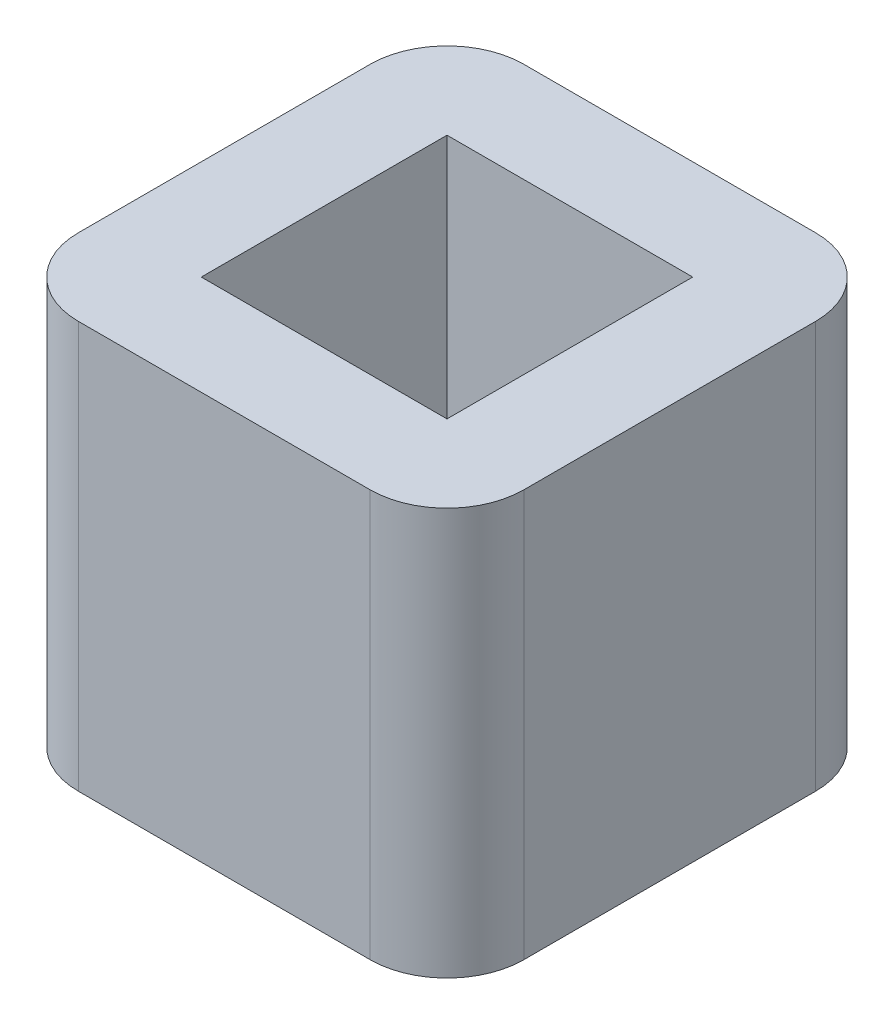
ISO-10303-21;
HEADER;
FILE_DESCRIPTION(('STEP AP214'),'2;1');
FILE_NAME('part.step','',(''),(''),'','','');
FILE_SCHEMA(('AUTOMOTIVE_DESIGN { 1 0 10303 214 1 1 1 1 }'));
ENDSEC;
DATA;
#1=APPLICATION_CONTEXT('core data for automotive mechanical design processes');
#2=APPLICATION_PROTOCOL_DEFINITION('international standard','automotive_design',2000,#1);
#3=PRODUCT_CONTEXT('',#1,'mechanical');
#4=PRODUCT('Part','Part','',(#3));
#5=PRODUCT_RELATED_PRODUCT_CATEGORY('part','',(#4));
#6=PRODUCT_DEFINITION_FORMATION('','',#4);
#7=PRODUCT_DEFINITION_CONTEXT('part definition',#1,'design');
#8=PRODUCT_DEFINITION('design','',#6,#7);
#9=PRODUCT_DEFINITION_SHAPE('','',#8);
#10=(LENGTH_UNIT() NAMED_UNIT(*) SI_UNIT(.MILLI.,.METRE.));
#11=(NAMED_UNIT(*) PLANE_ANGLE_UNIT() SI_UNIT($,.RADIAN.));
#12=(NAMED_UNIT(*) SI_UNIT($,.STERADIAN.) SOLID_ANGLE_UNIT());
#13=UNCERTAINTY_MEASURE_WITH_UNIT(LENGTH_MEASURE(1.E-05),#10,'distance_accuracy_value','');
#14=(GEOMETRIC_REPRESENTATION_CONTEXT(3) GLOBAL_UNCERTAINTY_ASSIGNED_CONTEXT((#13)) GLOBAL_UNIT_ASSIGNED_CONTEXT((#10,
#11,#12)) REPRESENTATION_CONTEXT('',''));
#15=CARTESIAN_POINT('',(0.,0.,0.));
#16=DIRECTION('',(0.,0.,1.));
#17=DIRECTION('',(1.,0.,0.));
#18=AXIS2_PLACEMENT_3D('',#15,#16,#17);
#19=CARTESIAN_POINT('',(19.,26.5,-19.));
#20=DIRECTION('',(0.,1.,0.));
#21=DIRECTION('',(0.,0.,1.));
#22=AXIS2_PLACEMENT_3D('',#19,#20,#21);
#23=PLANE('',#22);
#24=CARTESIAN_POINT('',(19.,26.5,-19.));
#25=DIRECTION('',(0.,1.,0.));
#26=DIRECTION('',(0.,0.,1.));
#27=AXIS2_PLACEMENT_3D('',#24,#25,#26);
#28=CIRCLE('',#27,10.);
#29=CARTESIAN_POINT('',(29.,26.5,-18.9999999999999));
#30=VERTEX_POINT('',#29);
#31=CARTESIAN_POINT('',(18.9999999999999,26.5,-29.));
#32=VERTEX_POINT('',#31);
#33=EDGE_CURVE('E158',#30,#32,#28,.T.);
#34=ORIENTED_EDGE('',*,*,#33,.T.);
#35=DIRECTION('',(-1.,0.,0.));
#36=VECTOR('',#35,1.);
#37=CARTESIAN_POINT('',(-18.9999999999999,26.5,-29.));
#38=LINE('',#37,#36);
#39=CARTESIAN_POINT('',(-19.,26.5,-29.));
#40=VERTEX_POINT('',#39);
#41=EDGE_CURVE('E161',#32,#40,#38,.T.);
#42=ORIENTED_EDGE('',*,*,#41,.T.);
#43=CARTESIAN_POINT('',(-19.,26.5,-19.));
#44=DIRECTION('',(0.,1.,0.));
#45=DIRECTION('',(0.,0.,-1.));
#46=AXIS2_PLACEMENT_3D('',#43,#44,#45);
#47=CIRCLE('',#46,10.);
#48=CARTESIAN_POINT('',(-29.,26.5,-18.9999999999999));
#49=VERTEX_POINT('',#48);
#50=EDGE_CURVE('E164',#40,#49,#47,.T.);
#51=ORIENTED_EDGE('',*,*,#50,.T.);
#52=DIRECTION('',(0.,0.,1.));
#53=VECTOR('',#52,1.);
#54=CARTESIAN_POINT('',(-29.,26.5,-18.9999999999999));
#55=LINE('',#54,#53);
#56=CARTESIAN_POINT('',(-29.,26.5,18.9999999999999));
#57=VERTEX_POINT('',#56);
#58=EDGE_CURVE('E166',#49,#57,#55,.T.);
#59=ORIENTED_EDGE('',*,*,#58,.T.);
#60=CARTESIAN_POINT('',(-19.,26.5,19.));
#61=DIRECTION('',(0.,1.,0.));
#62=DIRECTION('',(0.,0.,-1.));
#63=AXIS2_PLACEMENT_3D('',#60,#61,#62);
#64=CIRCLE('',#63,10.);
#65=CARTESIAN_POINT('',(-18.9999999999999,26.5,29.));
#66=VERTEX_POINT('',#65);
#67=EDGE_CURVE('E168',#57,#66,#64,.T.);
#68=ORIENTED_EDGE('',*,*,#67,.T.);
#69=DIRECTION('',(1.,0.,0.));
#70=VECTOR('',#69,1.);
#71=CARTESIAN_POINT('',(-18.9999999999999,26.5,29.));
#72=LINE('',#71,#70);
#73=CARTESIAN_POINT('',(18.9999999999999,26.5,29.));
#74=VERTEX_POINT('',#73);
#75=EDGE_CURVE('E170',#66,#74,#72,.T.);
#76=ORIENTED_EDGE('',*,*,#75,.T.);
#77=CARTESIAN_POINT('',(19.,26.5,19.));
#78=DIRECTION('',(0.,1.,0.));
#79=DIRECTION('',(0.,0.,-1.));
#80=AXIS2_PLACEMENT_3D('',#77,#78,#79);
#81=CIRCLE('',#80,10.);
#82=CARTESIAN_POINT('',(29.,26.5,18.9999999999999));
#83=VERTEX_POINT('',#82);
#84=EDGE_CURVE('E172',#74,#83,#81,.T.);
#85=ORIENTED_EDGE('',*,*,#84,.T.);
#86=DIRECTION('',(0.,0.,-1.));
#87=VECTOR('',#86,1.);
#88=CARTESIAN_POINT('',(29.,26.5,-18.9999999999999));
#89=LINE('',#88,#87);
#90=EDGE_CURVE('E174',#83,#30,#89,.T.);
#91=ORIENTED_EDGE('',*,*,#90,.T.);
#92=EDGE_LOOP('',(#34,#42,#51,#59,#68,#76,#85,#91));
#93=FACE_BOUND('',#92,.T.);
#94=DIRECTION('',(-1.,0.,0.));
#95=VECTOR('',#94,1.);
#96=CARTESIAN_POINT('',(-16.,26.5,-16.));
#97=LINE('',#96,#95);
#98=CARTESIAN_POINT('',(16.,26.5,-16.));
#99=VERTEX_POINT('',#98);
#100=CARTESIAN_POINT('',(-16.,26.5,-16.));
#101=VERTEX_POINT('',#100);
#102=EDGE_CURVE('E130',#99,#101,#97,.T.);
#103=ORIENTED_EDGE('',*,*,#102,.F.);
#104=DIRECTION('',(0.,0.,-1.));
#105=VECTOR('',#104,1.);
#106=CARTESIAN_POINT('',(16.,26.5,-16.));
#107=LINE('',#106,#105);
#108=CARTESIAN_POINT('',(16.,26.5,16.));
#109=VERTEX_POINT('',#108);
#110=EDGE_CURVE('E122',#109,#99,#107,.T.);
#111=ORIENTED_EDGE('',*,*,#110,.F.);
#112=DIRECTION('',(1.,0.,0.));
#113=VECTOR('',#112,1.);
#114=CARTESIAN_POINT('',(-16.,26.5,16.));
#115=LINE('',#114,#113);
#116=CARTESIAN_POINT('',(-16.,26.5,16.));
#117=VERTEX_POINT('',#116);
#118=EDGE_CURVE('E144',#117,#109,#115,.T.);
#119=ORIENTED_EDGE('',*,*,#118,.F.);
#120=DIRECTION('',(0.,0.,1.));
#121=VECTOR('',#120,1.);
#122=CARTESIAN_POINT('',(-16.,26.5,-16.));
#123=LINE('',#122,#121);
#124=EDGE_CURVE('E142',#101,#117,#123,.T.);
#125=ORIENTED_EDGE('',*,*,#124,.F.);
#126=EDGE_LOOP('',(#103,#111,#119,#125));
#127=FACE_BOUND('',#126,.T.);
#128=ADVANCED_FACE('F33',(#93,#127),#23,.T.);
#129=CARTESIAN_POINT('',(19.,-26.5,-19.));
#130=DIRECTION('',(0.,1.,0.));
#131=DIRECTION('',(0.,0.,1.));
#132=AXIS2_PLACEMENT_3D('',#129,#130,#131);
#133=PLANE('',#132);
#134=CARTESIAN_POINT('',(19.,-26.5,-19.));
#135=DIRECTION('',(0.,1.,0.));
#136=DIRECTION('',(0.,0.,1.));
#137=AXIS2_PLACEMENT_3D('',#134,#135,#136);
#138=CIRCLE('',#137,10.);
#139=CARTESIAN_POINT('',(29.,-26.5,-18.9999999999999));
#140=VERTEX_POINT('',#139);
#141=CARTESIAN_POINT('',(18.9999999999999,-26.5,-29.));
#142=VERTEX_POINT('',#141);
#143=EDGE_CURVE('E138',#140,#142,#138,.T.);
#144=ORIENTED_EDGE('',*,*,#143,.F.);
#145=DIRECTION('',(0.,0.,-1.));
#146=VECTOR('',#145,1.);
#147=CARTESIAN_POINT('',(29.,-26.5,-18.9999999999999));
#148=LINE('',#147,#146);
#149=CARTESIAN_POINT('',(29.,-26.5,18.9999999999999));
#150=VERTEX_POINT('',#149);
#151=EDGE_CURVE('E162',#150,#140,#148,.T.);
#152=ORIENTED_EDGE('',*,*,#151,.F.);
#153=CARTESIAN_POINT('',(19.,-26.5,19.));
#154=DIRECTION('',(0.,1.,0.));
#155=DIRECTION('',(0.,0.,-1.));
#156=AXIS2_PLACEMENT_3D('',#153,#154,#155);
#157=CIRCLE('',#156,10.);
#158=CARTESIAN_POINT('',(18.9999999999999,-26.5,29.));
#159=VERTEX_POINT('',#158);
#160=EDGE_CURVE('E189',#159,#150,#157,.T.);
#161=ORIENTED_EDGE('',*,*,#160,.F.);
#162=DIRECTION('',(1.,0.,0.));
#163=VECTOR('',#162,1.);
#164=CARTESIAN_POINT('',(-18.9999999999999,-26.5,29.));
#165=LINE('',#164,#163);
#166=CARTESIAN_POINT('',(-18.9999999999999,-26.5,29.));
#167=VERTEX_POINT('',#166);
#168=EDGE_CURVE('E187',#167,#159,#165,.T.);
#169=ORIENTED_EDGE('',*,*,#168,.F.);
#170=CARTESIAN_POINT('',(-19.,-26.5,19.));
#171=DIRECTION('',(0.,1.,0.));
#172=DIRECTION('',(0.,0.,-1.));
#173=AXIS2_PLACEMENT_3D('',#170,#171,#172);
#174=CIRCLE('',#173,10.);
#175=CARTESIAN_POINT('',(-29.,-26.5,18.9999999999999));
#176=VERTEX_POINT('',#175);
#177=EDGE_CURVE('E185',#176,#167,#174,.T.);
#178=ORIENTED_EDGE('',*,*,#177,.F.);
#179=DIRECTION('',(0.,0.,1.));
#180=VECTOR('',#179,1.);
#181=CARTESIAN_POINT('',(-29.,-26.5,-18.9999999999999));
#182=LINE('',#181,#180);
#183=CARTESIAN_POINT('',(-29.,-26.5,-18.9999999999999));
#184=VERTEX_POINT('',#183);
#185=EDGE_CURVE('E183',#184,#176,#182,.T.);
#186=ORIENTED_EDGE('',*,*,#185,.F.);
#187=CARTESIAN_POINT('',(-19.,-26.5,-19.));
#188=DIRECTION('',(0.,1.,0.));
#189=DIRECTION('',(0.,0.,-1.));
#190=AXIS2_PLACEMENT_3D('',#187,#188,#189);
#191=CIRCLE('',#190,10.);
#192=CARTESIAN_POINT('',(-19.,-26.5,-29.));
#193=VERTEX_POINT('',#192);
#194=EDGE_CURVE('E181',#193,#184,#191,.T.);
#195=ORIENTED_EDGE('',*,*,#194,.F.);
#196=DIRECTION('',(-1.,0.,0.));
#197=VECTOR('',#196,1.);
#198=CARTESIAN_POINT('',(-18.9999999999999,-26.5,-29.));
#199=LINE('',#198,#197);
#200=EDGE_CURVE('E179',#142,#193,#199,.T.);
#201=ORIENTED_EDGE('',*,*,#200,.F.);
#202=EDGE_LOOP('',(#144,#152,#161,#169,#178,#186,#195,#201));
#203=FACE_BOUND('',#202,.T.);
#204=DIRECTION('',(0.,0.,-1.));
#205=VECTOR('',#204,1.);
#206=CARTESIAN_POINT('',(16.,-26.5,-16.));
#207=LINE('',#206,#205);
#208=CARTESIAN_POINT('',(16.,-26.5,16.));
#209=VERTEX_POINT('',#208);
#210=CARTESIAN_POINT('',(16.,-26.5,-16.));
#211=VERTEX_POINT('',#210);
#212=EDGE_CURVE('E56',#209,#211,#207,.T.);
#213=ORIENTED_EDGE('',*,*,#212,.T.);
#214=DIRECTION('',(-1.,0.,0.));
#215=VECTOR('',#214,1.);
#216=CARTESIAN_POINT('',(-16.,-26.5,-16.));
#217=LINE('',#216,#215);
#218=CARTESIAN_POINT('',(-16.,-26.5,-16.));
#219=VERTEX_POINT('',#218);
#220=EDGE_CURVE('E137',#211,#219,#217,.T.);
#221=ORIENTED_EDGE('',*,*,#220,.T.);
#222=DIRECTION('',(0.,0.,1.));
#223=VECTOR('',#222,1.);
#224=CARTESIAN_POINT('',(-16.,-26.5,-16.));
#225=LINE('',#224,#223);
#226=CARTESIAN_POINT('',(-16.,-26.5,16.));
#227=VERTEX_POINT('',#226);
#228=EDGE_CURVE('E150',#219,#227,#225,.T.);
#229=ORIENTED_EDGE('',*,*,#228,.T.);
#230=DIRECTION('',(1.,0.,0.));
#231=VECTOR('',#230,1.);
#232=CARTESIAN_POINT('',(-16.,-26.5,16.));
#233=LINE('',#232,#231);
#234=EDGE_CURVE('E131',#227,#209,#233,.T.);
#235=ORIENTED_EDGE('',*,*,#234,.T.);
#236=EDGE_LOOP('',(#213,#221,#229,#235));
#237=FACE_BOUND('',#236,.T.);
#238=ADVANCED_FACE('F219',(#203,#237),#133,.F.);
#239=CARTESIAN_POINT('',(19.,26.5,-19.));
#240=DIRECTION('',(0.,-1.,0.));
#241=DIRECTION('',(0.,0.,-1.));
#242=AXIS2_PLACEMENT_3D('',#239,#240,#241);
#243=CYLINDRICAL_SURFACE('',#242,10.);
#244=ORIENTED_EDGE('',*,*,#143,.T.);
#245=DIRECTION('',(0.,-1.,0.));
#246=VECTOR('',#245,1.);
#247=CARTESIAN_POINT('',(18.9999999999999,26.5,-29.));
#248=LINE('',#247,#246);
#249=EDGE_CURVE('E11',#32,#142,#248,.T.);
#250=ORIENTED_EDGE('',*,*,#249,.F.);
#251=ORIENTED_EDGE('',*,*,#33,.F.);
#252=DIRECTION('',(0.,-1.,0.));
#253=VECTOR('',#252,1.);
#254=CARTESIAN_POINT('',(29.,26.5,-18.9999999999999));
#255=LINE('',#254,#253);
#256=EDGE_CURVE('E176',#30,#140,#255,.T.);
#257=ORIENTED_EDGE('',*,*,#256,.T.);
#258=EDGE_LOOP('',(#244,#250,#251,#257));
#259=FACE_BOUND('',#258,.T.);
#260=ADVANCED_FACE('F35',(#259),#243,.T.);
#261=CARTESIAN_POINT('',(-18.9999999999999,26.5,-29.));
#262=DIRECTION('',(0.,0.,1.));
#263=DIRECTION('',(1.,0.,0.));
#264=AXIS2_PLACEMENT_3D('',#261,#262,#263);
#265=PLANE('',#264);
#266=ORIENTED_EDGE('',*,*,#200,.T.);
#267=DIRECTION('',(0.,-1.,0.));
#268=VECTOR('',#267,1.);
#269=CARTESIAN_POINT('',(-19.,26.5,-29.));
#270=LINE('',#269,#268);
#271=EDGE_CURVE('E41',#40,#193,#270,.T.);
#272=ORIENTED_EDGE('',*,*,#271,.F.);
#273=ORIENTED_EDGE('',*,*,#41,.F.);
#274=ORIENTED_EDGE('',*,*,#249,.T.);
#275=EDGE_LOOP('',(#266,#272,#273,#274));
#276=FACE_BOUND('',#275,.T.);
#277=ADVANCED_FACE('F236',(#276),#265,.F.);
#278=CARTESIAN_POINT('',(-19.,26.5,-19.));
#279=DIRECTION('',(0.,-1.,0.));
#280=DIRECTION('',(0.,0.,-1.));
#281=AXIS2_PLACEMENT_3D('',#278,#279,#280);
#282=CYLINDRICAL_SURFACE('',#281,10.);
#283=ORIENTED_EDGE('',*,*,#194,.T.);
#284=DIRECTION('',(0.,-1.,0.));
#285=VECTOR('',#284,1.);
#286=CARTESIAN_POINT('',(-29.,26.5,-18.9999999999999));
#287=LINE('',#286,#285);
#288=EDGE_CURVE('E206',#49,#184,#287,.T.);
#289=ORIENTED_EDGE('',*,*,#288,.F.);
#290=ORIENTED_EDGE('',*,*,#50,.F.);
#291=ORIENTED_EDGE('',*,*,#271,.T.);
#292=EDGE_LOOP('',(#283,#289,#290,#291));
#293=FACE_BOUND('',#292,.T.);
#294=ADVANCED_FACE('F213',(#293),#282,.T.);
#295=CARTESIAN_POINT('',(-29.,26.5,-18.9999999999999));
#296=DIRECTION('',(1.,0.,0.));
#297=DIRECTION('',(0.,0.,-1.));
#298=AXIS2_PLACEMENT_3D('',#295,#296,#297);
#299=PLANE('',#298);
#300=ORIENTED_EDGE('',*,*,#185,.T.);
#301=DIRECTION('',(0.,-1.,0.));
#302=VECTOR('',#301,1.);
#303=CARTESIAN_POINT('',(-29.,26.5,18.9999999999999));
#304=LINE('',#303,#302);
#305=EDGE_CURVE('E203',#57,#176,#304,.T.);
#306=ORIENTED_EDGE('',*,*,#305,.F.);
#307=ORIENTED_EDGE('',*,*,#58,.F.);
#308=ORIENTED_EDGE('',*,*,#288,.T.);
#309=EDGE_LOOP('',(#300,#306,#307,#308));
#310=FACE_BOUND('',#309,.T.);
#311=ADVANCED_FACE('F225',(#310),#299,.F.);
#312=CARTESIAN_POINT('',(-19.,26.5,19.));
#313=DIRECTION('',(0.,-1.,0.));
#314=DIRECTION('',(0.,0.,-1.));
#315=AXIS2_PLACEMENT_3D('',#312,#313,#314);
#316=CYLINDRICAL_SURFACE('',#315,10.);
#317=ORIENTED_EDGE('',*,*,#177,.T.);
#318=DIRECTION('',(0.,-1.,0.));
#319=VECTOR('',#318,1.);
#320=CARTESIAN_POINT('',(-18.9999999999999,26.5,29.));
#321=LINE('',#320,#319);
#322=EDGE_CURVE('E200',#66,#167,#321,.T.);
#323=ORIENTED_EDGE('',*,*,#322,.F.);
#324=ORIENTED_EDGE('',*,*,#67,.F.);
#325=ORIENTED_EDGE('',*,*,#305,.T.);
#326=EDGE_LOOP('',(#317,#323,#324,#325));
#327=FACE_BOUND('',#326,.T.);
#328=ADVANCED_FACE('F229',(#327),#316,.T.);
#329=CARTESIAN_POINT('',(-18.9999999999999,26.5,29.));
#330=DIRECTION('',(0.,0.,-1.));
#331=DIRECTION('',(-1.,0.,0.));
#332=AXIS2_PLACEMENT_3D('',#329,#330,#331);
#333=PLANE('',#332);
#334=ORIENTED_EDGE('',*,*,#168,.T.);
#335=DIRECTION('',(0.,-1.,0.));
#336=VECTOR('',#335,1.);
#337=CARTESIAN_POINT('',(18.9999999999999,26.5,29.));
#338=LINE('',#337,#336);
#339=EDGE_CURVE('E197',#74,#159,#338,.T.);
#340=ORIENTED_EDGE('',*,*,#339,.F.);
#341=ORIENTED_EDGE('',*,*,#75,.F.);
#342=ORIENTED_EDGE('',*,*,#322,.T.);
#343=EDGE_LOOP('',(#334,#340,#341,#342));
#344=FACE_BOUND('',#343,.T.);
#345=ADVANCED_FACE('F249',(#344),#333,.F.);
#346=CARTESIAN_POINT('',(19.,26.5,19.));
#347=DIRECTION('',(0.,-1.,0.));
#348=DIRECTION('',(0.,0.,-1.));
#349=AXIS2_PLACEMENT_3D('',#346,#347,#348);
#350=CYLINDRICAL_SURFACE('',#349,10.);
#351=ORIENTED_EDGE('',*,*,#160,.T.);
#352=DIRECTION('',(0.,-1.,0.));
#353=VECTOR('',#352,1.);
#354=CARTESIAN_POINT('',(29.,26.5,18.9999999999999));
#355=LINE('',#354,#353);
#356=EDGE_CURVE('E194',#83,#150,#355,.T.);
#357=ORIENTED_EDGE('',*,*,#356,.F.);
#358=ORIENTED_EDGE('',*,*,#84,.F.);
#359=ORIENTED_EDGE('',*,*,#339,.T.);
#360=EDGE_LOOP('',(#351,#357,#358,#359));
#361=FACE_BOUND('',#360,.T.);
#362=ADVANCED_FACE('F247',(#361),#350,.T.);
#363=CARTESIAN_POINT('',(29.,26.5,-18.9999999999999));
#364=DIRECTION('',(-1.,0.,0.));
#365=DIRECTION('',(0.,0.,1.));
#366=AXIS2_PLACEMENT_3D('',#363,#364,#365);
#367=PLANE('',#366);
#368=ORIENTED_EDGE('',*,*,#151,.T.);
#369=ORIENTED_EDGE('',*,*,#256,.F.);
#370=ORIENTED_EDGE('',*,*,#90,.F.);
#371=ORIENTED_EDGE('',*,*,#356,.T.);
#372=EDGE_LOOP('',(#368,#369,#370,#371));
#373=FACE_BOUND('',#372,.T.);
#374=ADVANCED_FACE('F242',(#373),#367,.F.);
#375=CARTESIAN_POINT('',(16.,26.5,-16.));
#376=DIRECTION('',(-1.,0.,0.));
#377=DIRECTION('',(0.,0.,1.));
#378=AXIS2_PLACEMENT_3D('',#375,#376,#377);
#379=PLANE('',#378);
#380=ORIENTED_EDGE('',*,*,#212,.F.);
#381=DIRECTION('',(0.,-1.,0.));
#382=VECTOR('',#381,1.);
#383=CARTESIAN_POINT('',(16.,26.5,16.));
#384=LINE('',#383,#382);
#385=EDGE_CURVE('E126',#109,#209,#384,.T.);
#386=ORIENTED_EDGE('',*,*,#385,.F.);
#387=ORIENTED_EDGE('',*,*,#110,.T.);
#388=DIRECTION('',(0.,-1.,0.));
#389=VECTOR('',#388,1.);
#390=CARTESIAN_POINT('',(16.,26.5,-16.));
#391=LINE('',#390,#389);
#392=EDGE_CURVE('E125',#99,#211,#391,.T.);
#393=ORIENTED_EDGE('',*,*,#392,.T.);
#394=EDGE_LOOP('',(#380,#386,#387,#393));
#395=FACE_BOUND('',#394,.T.);
#396=ADVANCED_FACE('F124',(#395),#379,.T.);
#397=CARTESIAN_POINT('',(-16.,26.5,-16.));
#398=DIRECTION('',(0.,0.,1.));
#399=DIRECTION('',(1.,0.,0.));
#400=AXIS2_PLACEMENT_3D('',#397,#398,#399);
#401=PLANE('',#400);
#402=ORIENTED_EDGE('',*,*,#220,.F.);
#403=ORIENTED_EDGE('',*,*,#392,.F.);
#404=ORIENTED_EDGE('',*,*,#102,.T.);
#405=DIRECTION('',(0.,-1.,0.));
#406=VECTOR('',#405,1.);
#407=CARTESIAN_POINT('',(-16.,26.5,-16.));
#408=LINE('',#407,#406);
#409=EDGE_CURVE('E139',#101,#219,#408,.T.);
#410=ORIENTED_EDGE('',*,*,#409,.T.);
#411=EDGE_LOOP('',(#402,#403,#404,#410));
#412=FACE_BOUND('',#411,.T.);
#413=ADVANCED_FACE('F134',(#412),#401,.T.);
#414=CARTESIAN_POINT('',(-16.,26.5,-16.));
#415=DIRECTION('',(1.,0.,0.));
#416=DIRECTION('',(0.,0.,-1.));
#417=AXIS2_PLACEMENT_3D('',#414,#415,#416);
#418=PLANE('',#417);
#419=ORIENTED_EDGE('',*,*,#228,.F.);
#420=ORIENTED_EDGE('',*,*,#409,.F.);
#421=ORIENTED_EDGE('',*,*,#124,.T.);
#422=DIRECTION('',(0.,-1.,0.));
#423=VECTOR('',#422,1.);
#424=CARTESIAN_POINT('',(-16.,26.5,16.));
#425=LINE('',#424,#423);
#426=EDGE_CURVE('E48',#117,#227,#425,.T.);
#427=ORIENTED_EDGE('',*,*,#426,.T.);
#428=EDGE_LOOP('',(#419,#420,#421,#427));
#429=FACE_BOUND('',#428,.T.);
#430=ADVANCED_FACE('F274',(#429),#418,.T.);
#431=CARTESIAN_POINT('',(-16.,26.5,16.));
#432=DIRECTION('',(0.,0.,-1.));
#433=DIRECTION('',(-1.,0.,0.));
#434=AXIS2_PLACEMENT_3D('',#431,#432,#433);
#435=PLANE('',#434);
#436=ORIENTED_EDGE('',*,*,#234,.F.);
#437=ORIENTED_EDGE('',*,*,#426,.F.);
#438=ORIENTED_EDGE('',*,*,#118,.T.);
#439=ORIENTED_EDGE('',*,*,#385,.T.);
#440=EDGE_LOOP('',(#436,#437,#438,#439));
#441=FACE_BOUND('',#440,.T.);
#442=ADVANCED_FACE('F278',(#441),#435,.T.);
#443=CLOSED_SHELL('',(#128,#238,#260,#277,#294,#311,#328,#345,#362,#374,#396,#413,#430,#442));
#444=MANIFOLD_SOLID_BREP('B2',#443);
#445=ADVANCED_BREP_SHAPE_REPRESENTATION('',(#18,#444),#14);
#446=SHAPE_DEFINITION_REPRESENTATION(#9,#445);
ENDSEC;
END-ISO-10303-21;
